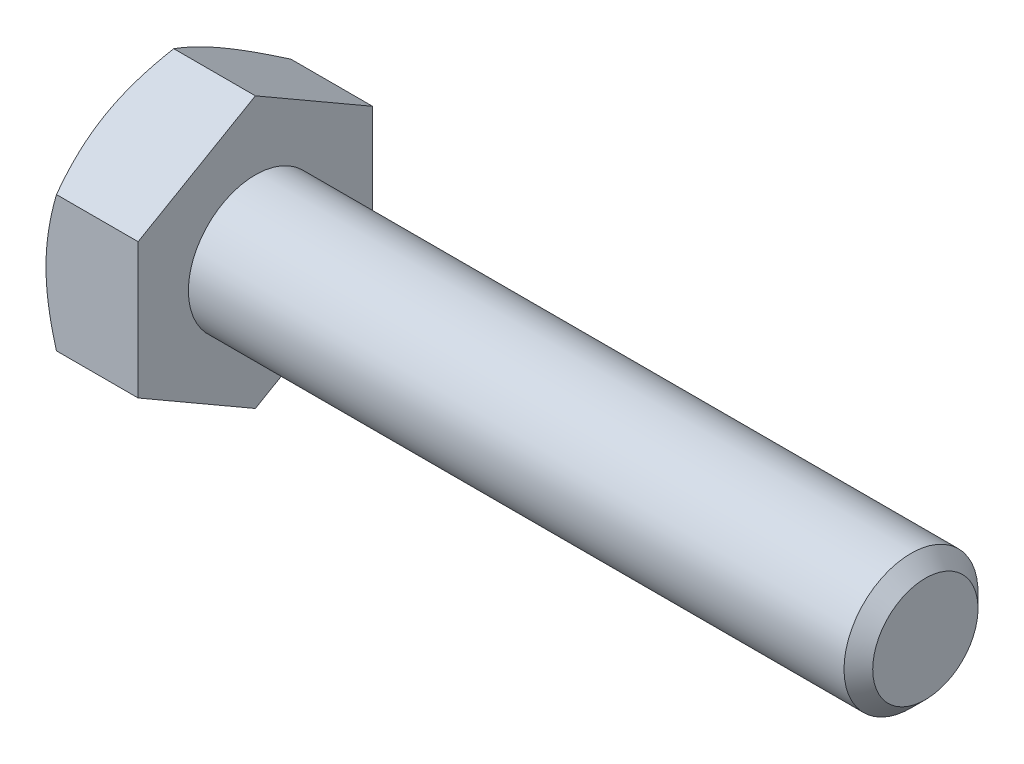
ISO-10303-21;
HEADER;
FILE_DESCRIPTION(('STEP AP214'),'2;1');
FILE_NAME('part.step','',(''),(''),'','','');
FILE_SCHEMA(('AUTOMOTIVE_DESIGN { 1 0 10303 214 1 1 1 1 }'));
ENDSEC;
DATA;
#1=APPLICATION_CONTEXT('core data for automotive mechanical design processes');
#2=APPLICATION_PROTOCOL_DEFINITION('international standard','automotive_design',2000,#1);
#3=PRODUCT_CONTEXT('',#1,'mechanical');
#4=PRODUCT('Part','Part','',(#3));
#5=PRODUCT_RELATED_PRODUCT_CATEGORY('part','',(#4));
#6=PRODUCT_DEFINITION_FORMATION('','',#4);
#7=PRODUCT_DEFINITION_CONTEXT('part definition',#1,'design');
#8=PRODUCT_DEFINITION('design','',#6,#7);
#9=PRODUCT_DEFINITION_SHAPE('','',#8);
#10=(LENGTH_UNIT() NAMED_UNIT(*) SI_UNIT(.MILLI.,.METRE.));
#11=(NAMED_UNIT(*) PLANE_ANGLE_UNIT() SI_UNIT($,.RADIAN.));
#12=(NAMED_UNIT(*) SI_UNIT($,.STERADIAN.) SOLID_ANGLE_UNIT());
#13=UNCERTAINTY_MEASURE_WITH_UNIT(LENGTH_MEASURE(1.E-05),#10,'distance_accuracy_value','');
#14=(GEOMETRIC_REPRESENTATION_CONTEXT(3) GLOBAL_UNCERTAINTY_ASSIGNED_CONTEXT((#13)) GLOBAL_UNIT_ASSIGNED_CONTEXT((#10,
#11,#12)) REPRESENTATION_CONTEXT('',''));
#15=CARTESIAN_POINT('',(0.,0.,0.));
#16=DIRECTION('',(0.,0.,1.));
#17=DIRECTION('',(1.,0.,0.));
#18=AXIS2_PLACEMENT_3D('',#15,#16,#17);
#19=CARTESIAN_POINT('',(-18.0578125,-3.20790243318485,5.55625));
#20=DIRECTION('',(0.,0.,-1.));
#21=DIRECTION('',(-1.,0.,0.));
#22=AXIS2_PLACEMENT_3D('',#19,#20,#21);
#23=PLANE('',#22);
#24=CARTESIAN_POINT('',(-15.2843750598475,-8.74399027782085,5.55625));
#25=CARTESIAN_POINT('',(-15.4031476461868,-8.50018623960062,5.55625));
#26=CARTESIAN_POINT('',(-15.5208174899284,-8.25583594381363,5.55625));
#27=CARTESIAN_POINT('',(-15.753333832282,-7.76575275757413,5.55625));
#28=CARTESIAN_POINT('',(-15.868179909394,-7.52001966736057,5.55625));
#29=CARTESIAN_POINT('',(-16.0949815667827,-7.02567502384834,5.55625));
#30=CARTESIAN_POINT('',(-16.2069190770691,-6.77705515244963,5.55625));
#31=CARTESIAN_POINT('',(-16.4263791452201,-6.27788161036476,5.55625));
#32=CARTESIAN_POINT('',(-16.5339019036307,-6.02732802813559,5.55625));
#33=CARTESIAN_POINT('',(-16.7469068972481,-5.51539046395943,5.55625));
#34=CARTESIAN_POINT('',(-16.852197701029,-5.25392641019769,5.55625));
#35=CARTESIAN_POINT('',(-17.0551139859531,-4.72798657633179,5.55625));
#36=CARTESIAN_POINT('',(-17.1527386251359,-4.46351046906169,5.55625));
#37=CARTESIAN_POINT('',(-17.3378532159805,-3.93158168881508,5.55625));
#38=CARTESIAN_POINT('',(-17.4253626158621,-3.66413584916098,5.55625));
#39=CARTESIAN_POINT('',(-17.5875224426472,-3.12540698244495,5.55625));
#40=CARTESIAN_POINT('',(-17.6621767862806,-2.8541251515052,5.55625));
#41=CARTESIAN_POINT('',(-17.7947361579561,-2.30908269819076,5.55625));
#42=CARTESIAN_POINT('',(-17.8527346690269,-2.03534517239951,5.55625));
#43=CARTESIAN_POINT('',(-17.9487733321313,-1.4842981003853,5.55625));
#44=CARTESIAN_POINT('',(-17.9868156464521,-1.20698894449172,5.55625));
#45=CARTESIAN_POINT('',(-18.0263928025883,-0.79129473023844,5.55625));
#46=CARTESIAN_POINT('',(-18.0366589019217,-0.653708210797405,5.55625));
#47=CARTESIAN_POINT('',(-18.0513621872178,-0.3782286898733,5.55625));
#48=CARTESIAN_POINT('',(-18.0557999263492,-0.240335718720036,5.55625));
#49=CARTESIAN_POINT('',(-18.0587354775746,0.035525129473498,5.55625));
#50=CARTESIAN_POINT('',(-18.0572327728321,0.173493011987118,5.55625));
#51=CARTESIAN_POINT('',(-18.0483265101621,0.449228444418538,5.55625));
#52=CARTESIAN_POINT('',(-18.0409231815845,0.586996001914223,5.55625));
#53=CARTESIAN_POINT('',(-18.0164869357947,0.914267814879004,5.55625));
#54=CARTESIAN_POINT('',(-17.9968672240741,1.10358330996904,5.55625));
#55=CARTESIAN_POINT('',(-17.947526812407,1.48088314069775,5.55625));
#56=CARTESIAN_POINT('',(-17.9178048478651,1.66886730667232,5.55625));
#57=CARTESIAN_POINT('',(-17.8150555520625,2.23056093652213,5.55625));
#58=CARTESIAN_POINT('',(-17.7284606134045,2.60182549681906,5.55625));
#59=CARTESIAN_POINT('',(-17.5773261064939,3.15725728719583,5.55625));
#60=CARTESIAN_POINT('',(-17.5226586125065,3.3442770213325,5.55625));
#61=CARTESIAN_POINT('',(-17.4074060536328,3.71650214758287,5.55625));
#62=CARTESIAN_POINT('',(-17.3468209432783,3.90170752574391,5.55625));
#63=CARTESIAN_POINT('',(-17.2207250472581,4.27035971017339,5.55625));
#64=CARTESIAN_POINT('',(-17.1552156566373,4.45380699802655,5.55625));
#65=CARTESIAN_POINT('',(-17.0200659146603,4.81916376337002,5.55625));
#66=CARTESIAN_POINT('',(-16.9504256570347,5.00107327564605,5.55625));
#67=CARTESIAN_POINT('',(-16.7580333966823,5.48965633955828,5.55625));
#68=CARTESIAN_POINT('',(-16.6320472769738,5.79505515575442,5.55625));
#69=CARTESIAN_POINT('',(-16.3726962852557,6.40271511378121,5.55625));
#70=CARTESIAN_POINT('',(-16.2393306013023,6.70497590598521,5.55625));
#71=CARTESIAN_POINT('',(-15.9669631146457,7.30707795189491,5.55625));
#72=CARTESIAN_POINT('',(-15.8279591790448,7.60691823753555,5.55625));
#73=CARTESIAN_POINT('',(-15.5456603653161,8.20455029953287,5.55625));
#74=CARTESIAN_POINT('',(-15.4023656605298,8.50234215804727,5.55625));
#75=CARTESIAN_POINT('',(-15.1121870855033,9.09675869917467,5.55625));
#76=CARTESIAN_POINT('',(-14.9652978399505,9.39338075230971,5.55625));
#77=CARTESIAN_POINT('',(-14.668841477218,9.98528417281852,5.55625));
#78=CARTESIAN_POINT('',(-14.5192743379345,10.2805655291008,5.55625));
#79=CARTESIAN_POINT('',(-14.0674394266152,11.1646418956815,5.55625));
#80=CARTESIAN_POINT('',(-13.7619730016145,11.7518013851031,5.55625));
#81=CARTESIAN_POINT('',(-13.1778679596005,12.8613257548756,5.55625));
#82=CARTESIAN_POINT('',(-12.8997985850975,13.3839917708193,5.55625));
#83=CARTESIAN_POINT('',(-12.340301428865,14.42756352459,5.55625));
#84=CARTESIAN_POINT('',(-12.0588734420222,14.9484691523898,5.55625));
#85=CARTESIAN_POINT('',(-11.4944769946515,15.9871872994246,5.55625));
#86=CARTESIAN_POINT('',(-11.2115168360065,16.5050043366708,5.55625));
#87=CARTESIAN_POINT('',(-10.6436898665637,17.5395393792358,5.55625));
#88=CARTESIAN_POINT('',(-10.3588232075218,18.056257467815,5.55625));
#89=CARTESIAN_POINT('',(-10.0732623528106,18.5725892171576,5.55625));
#90=B_SPLINE_CURVE_WITH_KNOTS('',3,(#24,#25,#26,#27,#28,#29,#30,#31,#32,#33,#34,#35,#36,#37,#38,
#39,#40,#41,#42,#43,#44,#45,#46,#47,#48,#49,#50,#51,#52,#53,#54,#55,#56,#57,#58,#59,#60,#61,#62,
#63,#64,#65,#66,#67,#68,#69,#70,#71,#72,#73,#74,#75,#76,#77,#78,#79,#80,#81,#82,#83,#84,#85,#86,
#87,#88,#89),.UNSPECIFIED.,.F.,.F.,(4,2,2,2,2,2,2,2,2,2,2,2,2,2,2,2,2,2,2,2,2,2,2,2,2,2,2,2,2,2,
2,2,4),(0.,0.813597715870462,1.62731614804298,2.44525275654031,3.26315216797368,
4.10866347940256,4.95426752225437,5.79821771301645,6.64191030891903,7.48077063935046,
8.31954005908318,8.73334237828505,9.1471054207352,9.56090446260157,9.97468742138603,
10.5453561295019,11.1160962999972,12.2581342200709,12.8426194652768,13.4271092017353,
14.0114339722529,14.5957454893196,15.586695188948,16.5777541364282,17.5691915541017,
18.560588972886,19.5535724635683,20.5465641542476,22.5321054768716,24.308190208571,
26.0843839680985,27.8546363109357,29.624749380466),.UNSPECIFIED.);
#91=CARTESIAN_POINT('',(-17.5615482665182,-3.20790243318485,5.55625));
#92=VERTEX_POINT('',#91);
#93=CARTESIAN_POINT('',(-18.0578125,0.,5.55625));
#94=VERTEX_POINT('',#93);
#95=EDGE_CURVE('E254',#92,#94,#90,.T.);
#96=ORIENTED_EDGE('',*,*,#95,.F.);
#97=DIRECTION('',(1.,0.,0.));
#98=VECTOR('',#97,1.);
#99=CARTESIAN_POINT('',(-18.0578125,-3.20790243318485,5.55625));
#100=LINE('',#99,#98);
#101=CARTESIAN_POINT('',(-13.6921875,-3.20790243318485,5.55625));
#102=VERTEX_POINT('',#101);
#103=EDGE_CURVE('E257',#92,#102,#100,.T.);
#104=ORIENTED_EDGE('',*,*,#103,.T.);
#105=DIRECTION('',(0.,1.,0.));
#106=VECTOR('',#105,1.);
#107=CARTESIAN_POINT('',(-13.6921875,-3.20790243318485,5.55625));
#108=LINE('',#107,#106);
#109=CARTESIAN_POINT('',(-13.6921875,3.20790243318486,5.55625));
#110=VERTEX_POINT('',#109);
#111=EDGE_CURVE('E259',#102,#110,#108,.T.);
#112=ORIENTED_EDGE('',*,*,#111,.T.);
#113=DIRECTION('',(1.,0.,0.));
#114=VECTOR('',#113,1.);
#115=CARTESIAN_POINT('',(-18.0578125,3.20790243318486,5.55625));
#116=LINE('',#115,#114);
#117=CARTESIAN_POINT('',(-17.5615482665182,3.20790243318486,5.55625));
#118=VERTEX_POINT('',#117);
#119=EDGE_CURVE('E227',#118,#110,#116,.T.);
#120=ORIENTED_EDGE('',*,*,#119,.F.);
#121=EDGE_CURVE('E111',#94,#118,#90,.T.);
#122=ORIENTED_EDGE('',*,*,#121,.F.);
#123=EDGE_LOOP('',(#96,#104,#112,#120,#122));
#124=FACE_BOUND('',#123,.T.);
#125=ADVANCED_FACE('F35',(#124),#23,.F.);
#126=CARTESIAN_POINT('',(-18.0578125,3.20790243318486,5.55625));
#127=DIRECTION('',(0.,-0.866025403784439,-0.5));
#128=DIRECTION('',(0.,0.5,-0.866025403784439));
#129=AXIS2_PLACEMENT_3D('',#126,#127,#128);
#130=PLANE('',#129);
#131=CARTESIAN_POINT('',(-17.5614815980518,3.20778696313102,5.55645));
#132=CARTESIAN_POINT('',(-17.6021869396287,3.27830048099898,5.43431700443227));
#133=CARTESIAN_POINT('',(-17.6410449606368,3.34907690760433,5.31172863757365));
#134=CARTESIAN_POINT('',(-17.7145575665754,3.49120454378004,5.06555635055765));
#135=CARTESIAN_POINT('',(-17.7492103381981,3.56255598725623,4.94197202526351));
#136=CARTESIAN_POINT('',(-17.8461806144389,3.7777527611819,4.56924027919934));
#137=CARTESIAN_POINT('',(-17.901336445498,3.92244755263586,4.3186215488105));
#138=CARTESIAN_POINT('',(-17.966013595153,4.13898067940738,3.94357517172046));
#139=CARTESIAN_POINT('',(-17.9844383296374,4.21017202280888,3.82026814788998));
#140=CARTESIAN_POINT('',(-18.0153341337597,4.35287639627881,3.57309692257779));
#141=CARTESIAN_POINT('',(-18.027805729438,4.42438939736052,3.44923277130254));
#142=CARTESIAN_POINT('',(-18.0464774134017,4.56753961185542,3.20128932668299));
#143=CARTESIAN_POINT('',(-18.0526846193166,4.63917659144933,3.07721043832556));
#144=CARTESIAN_POINT('',(-18.0587010825862,4.7825127822332,2.82894487332451));
#145=CARTESIAN_POINT('',(-18.0585105375727,4.85421199143242,2.70475820012895));
#146=CARTESIAN_POINT('',(-18.0491942573071,5.05064720059278,2.36452243746779));
#147=CARTESIAN_POINT('',(-18.0335528403106,5.1753189069971,2.14858470770919));
#148=CARTESIAN_POINT('',(-17.9839525950254,5.42383425573453,1.71814349723526));
#149=CARTESIAN_POINT('',(-17.9499768117333,5.54767702400135,1.50364153044716));
#150=CARTESIAN_POINT('',(-17.8650467499519,5.79669255822861,1.07233397329164));
#151=CARTESIAN_POINT('',(-17.8137326119579,5.92183390122649,0.8555828090919));
#152=CARTESIAN_POINT('',(-17.6972700447076,6.17025031750737,0.425312954659249));
#153=CARTESIAN_POINT('',(-17.6321489741206,6.29352857247572,0.211788753585623));
#154=CARTESIAN_POINT('',(-17.5614815980518,6.41592033642355,-0.000199999999998247));
#155=B_SPLINE_CURVE_WITH_KNOTS('',3,(#131,#132,#133,#134,#135,#136,#137,#138,#139,#140,#141,
#142,#143,#144,#145,#146,#147,#148,#149,#150,#151,#152,#153,#154),.UNSPECIFIED.,.F.,.F.,(4,2,2,
2,2,2,2,2,2,2,2,4),(0.,0.440316908268042,0.880823012040824,1.76366572331169,2.19427472390783,
2.62484566732156,3.05492684132792,3.4849947297767,4.23370964386675,4.98311813377593,
5.74914806559357,6.51367405016873),.UNSPECIFIED.);
#156=CARTESIAN_POINT('',(-18.0578125,4.81185364977729,2.778125));
#157=VERTEX_POINT('',#156);
#158=EDGE_CURVE('E107',#118,#157,#155,.T.);
#159=ORIENTED_EDGE('',*,*,#158,.F.);
#160=ORIENTED_EDGE('',*,*,#119,.T.);
#161=DIRECTION('',(0.,0.5,-0.866025403784438));
#162=VECTOR('',#161,1.);
#163=CARTESIAN_POINT('',(-13.6921875,3.20790243318486,5.55625));
#164=LINE('',#163,#162);
#165=CARTESIAN_POINT('',(-13.6921875,6.41580486636972,0.));
#166=VERTEX_POINT('',#165);
#167=EDGE_CURVE('E277',#110,#166,#164,.T.);
#168=ORIENTED_EDGE('',*,*,#167,.T.);
#169=DIRECTION('',(1.,0.,0.));
#170=VECTOR('',#169,1.);
#171=CARTESIAN_POINT('',(-18.0578125,6.41580486636972,0.));
#172=LINE('',#171,#170);
#173=CARTESIAN_POINT('',(-17.5615482665182,6.41580486636972,0.));
#174=VERTEX_POINT('',#173);
#175=EDGE_CURVE('E130',#174,#166,#172,.T.);
#176=ORIENTED_EDGE('',*,*,#175,.F.);
#177=EDGE_CURVE('E115',#157,#174,#155,.T.);
#178=ORIENTED_EDGE('',*,*,#177,.F.);
#179=EDGE_LOOP('',(#159,#160,#168,#176,#178));
#180=FACE_BOUND('',#179,.T.);
#181=ADVANCED_FACE('F128',(#180),#130,.F.);
#182=CARTESIAN_POINT('',(-18.0578125,6.41580486636972,0.));
#183=DIRECTION('',(0.,-0.866025403784439,0.5));
#184=DIRECTION('',(0.,-0.5,-0.866025403784439));
#185=AXIS2_PLACEMENT_3D('',#182,#183,#184);
#186=PLANE('',#185);
#187=CARTESIAN_POINT('',(-17.5614815980518,6.41592033642355,0.000200000000001893));
#188=CARTESIAN_POINT('',(-17.6021869396287,6.34540681855559,-0.121932995567729));
#189=CARTESIAN_POINT('',(-17.6410449606368,6.27463039195025,-0.244521362426351));
#190=CARTESIAN_POINT('',(-17.7145575665754,6.13250275577453,-0.490693649442355));
#191=CARTESIAN_POINT('',(-17.7492103381981,6.06115131229835,-0.614277974736486));
#192=CARTESIAN_POINT('',(-17.8461806144389,5.84595453837268,-0.987009720800661));
#193=CARTESIAN_POINT('',(-17.901336445498,5.70125974691872,-1.2376284511895));
#194=CARTESIAN_POINT('',(-17.966013595153,5.48472662014719,-1.61267482827954));
#195=CARTESIAN_POINT('',(-17.9844383296374,5.41353527674569,-1.73598185211002));
#196=CARTESIAN_POINT('',(-18.0153341337597,5.27083090327577,-1.98315307742221));
#197=CARTESIAN_POINT('',(-18.027805729438,5.19931790219406,-2.10701722869746));
#198=CARTESIAN_POINT('',(-18.0464774134017,5.05616768769916,-2.35496067331701));
#199=CARTESIAN_POINT('',(-18.0526846193166,4.98453070810525,-2.47903956167444));
#200=CARTESIAN_POINT('',(-18.0587010825862,4.84119451732138,-2.72730512667549));
#201=CARTESIAN_POINT('',(-18.0585105375727,4.76949530812216,-2.85149179987105));
#202=CARTESIAN_POINT('',(-18.0491942573071,4.5730600989618,-3.19172756253221));
#203=CARTESIAN_POINT('',(-18.0335528403106,4.44838839255747,-3.40766529229081));
#204=CARTESIAN_POINT('',(-17.9839525950254,4.19987304382004,-3.83810650276474));
#205=CARTESIAN_POINT('',(-17.9499768117333,4.07603027555323,-4.05260846955284));
#206=CARTESIAN_POINT('',(-17.8650467499519,3.82701474132597,-4.48391602670836));
#207=CARTESIAN_POINT('',(-17.8137326119579,3.70187339832809,-4.7006671909081));
#208=CARTESIAN_POINT('',(-17.6972700447076,3.45345698204721,-5.13093704534075));
#209=CARTESIAN_POINT('',(-17.6321489741206,3.33017872707885,-5.34446124641438));
#210=CARTESIAN_POINT('',(-17.5614815980518,3.20778696313102,-5.55645));
#211=B_SPLINE_CURVE_WITH_KNOTS('',3,(#187,#188,#189,#190,#191,#192,#193,#194,#195,#196,#197,
#198,#199,#200,#201,#202,#203,#204,#205,#206,#207,#208,#209,#210),.UNSPECIFIED.,.F.,.F.,(4,2,2,
2,2,2,2,2,2,2,2,4),(0.,0.440316908268041,0.880823012040823,1.76366572331169,2.19427472390783,
2.62484566732156,3.05492684132792,3.48499472977669,4.23370964386674,4.98311813377593,
5.74914806559356,6.51367405016872),.UNSPECIFIED.);
#212=CARTESIAN_POINT('',(-18.0578125,4.81185364977729,-2.778125));
#213=VERTEX_POINT('',#212);
#214=EDGE_CURVE('E120',#174,#213,#211,.T.);
#215=ORIENTED_EDGE('',*,*,#214,.F.);
#216=ORIENTED_EDGE('',*,*,#175,.T.);
#217=DIRECTION('',(0.,-0.5,-0.866025403784439));
#218=VECTOR('',#217,1.);
#219=CARTESIAN_POINT('',(-13.6921875,6.41580486636972,0.));
#220=LINE('',#219,#218);
#221=CARTESIAN_POINT('',(-13.6921875,3.20790243318486,-5.55625));
#222=VERTEX_POINT('',#221);
#223=EDGE_CURVE('E274',#166,#222,#220,.T.);
#224=ORIENTED_EDGE('',*,*,#223,.T.);
#225=DIRECTION('',(1.,0.,0.));
#226=VECTOR('',#225,1.);
#227=CARTESIAN_POINT('',(-18.0578125,3.20790243318486,-5.55625));
#228=LINE('',#227,#226);
#229=CARTESIAN_POINT('',(-17.5615482665182,3.20790243318486,-5.55625));
#230=VERTEX_POINT('',#229);
#231=EDGE_CURVE('E271',#230,#222,#228,.T.);
#232=ORIENTED_EDGE('',*,*,#231,.F.);
#233=EDGE_CURVE('E131',#213,#230,#211,.T.);
#234=ORIENTED_EDGE('',*,*,#233,.F.);
#235=EDGE_LOOP('',(#215,#216,#224,#232,#234));
#236=FACE_BOUND('',#235,.T.);
#237=ADVANCED_FACE('F191',(#236),#186,.F.);
#238=CARTESIAN_POINT('',(-18.0578125,3.20790243318486,-5.55625));
#239=DIRECTION('',(0.,0.,1.));
#240=DIRECTION('',(1.,0.,0.));
#241=AXIS2_PLACEMENT_3D('',#238,#239,#240);
#242=PLANE('',#241);
#243=CARTESIAN_POINT('',(-15.2843750598475,-8.74399027782085,-5.55625));
#244=CARTESIAN_POINT('',(-15.4031476461868,-8.50018623960062,-5.55625));
#245=CARTESIAN_POINT('',(-15.5208174899284,-8.25583594381363,-5.55625));
#246=CARTESIAN_POINT('',(-15.753333832282,-7.76575275757413,-5.55625));
#247=CARTESIAN_POINT('',(-15.868179909394,-7.52001966736057,-5.55625));
#248=CARTESIAN_POINT('',(-16.0949815667827,-7.02567502384834,-5.55625));
#249=CARTESIAN_POINT('',(-16.2069190770691,-6.77705515244963,-5.55625));
#250=CARTESIAN_POINT('',(-16.4263791452201,-6.27788161036476,-5.55625));
#251=CARTESIAN_POINT('',(-16.5339019036307,-6.02732802813559,-5.55625));
#252=CARTESIAN_POINT('',(-16.7469068972481,-5.51539046395943,-5.55625));
#253=CARTESIAN_POINT('',(-16.852197701029,-5.25392641019769,-5.55625));
#254=CARTESIAN_POINT('',(-17.0551139859531,-4.72798657633179,-5.55625));
#255=CARTESIAN_POINT('',(-17.1527386251359,-4.46351046906169,-5.55625));
#256=CARTESIAN_POINT('',(-17.3378532159805,-3.93158168881508,-5.55625));
#257=CARTESIAN_POINT('',(-17.4253626158621,-3.66413584916098,-5.55625));
#258=CARTESIAN_POINT('',(-17.5875224426472,-3.12540698244495,-5.55625));
#259=CARTESIAN_POINT('',(-17.6621767862806,-2.8541251515052,-5.55625));
#260=CARTESIAN_POINT('',(-17.7947361579561,-2.30908269819076,-5.55625));
#261=CARTESIAN_POINT('',(-17.8527346690269,-2.03534517239951,-5.55625));
#262=CARTESIAN_POINT('',(-17.9487733321313,-1.4842981003853,-5.55625));
#263=CARTESIAN_POINT('',(-17.9868156464521,-1.20698894449172,-5.55625));
#264=CARTESIAN_POINT('',(-18.0263928025883,-0.791294730238441,-5.55625));
#265=CARTESIAN_POINT('',(-18.0366589019217,-0.653708210797407,-5.55625));
#266=CARTESIAN_POINT('',(-18.0513621872178,-0.378228689873302,-5.55625));
#267=CARTESIAN_POINT('',(-18.0557999263492,-0.240335718720039,-5.55625));
#268=CARTESIAN_POINT('',(-18.0587354775746,0.0355251294734939,-5.55625));
#269=CARTESIAN_POINT('',(-18.0572327728321,0.173493011987113,-5.55625));
#270=CARTESIAN_POINT('',(-18.0483265101621,0.449228444418532,-5.55625));
#271=CARTESIAN_POINT('',(-18.0409231815845,0.586996001914216,-5.55625));
#272=CARTESIAN_POINT('',(-18.0164869357947,0.914267814878997,-5.55625));
#273=CARTESIAN_POINT('',(-17.9968672240741,1.10358330996903,-5.55625));
#274=CARTESIAN_POINT('',(-17.947526812407,1.48088314069774,-5.55625));
#275=CARTESIAN_POINT('',(-17.9178048478651,1.66886730667231,-5.55625));
#276=CARTESIAN_POINT('',(-17.8150555520625,2.23056093652212,-5.55625));
#277=CARTESIAN_POINT('',(-17.7284606134045,2.60182549681905,-5.55625));
#278=CARTESIAN_POINT('',(-17.5773261064939,3.15725728719582,-5.55625));
#279=CARTESIAN_POINT('',(-17.5226586125065,3.34427702133249,-5.55625));
#280=CARTESIAN_POINT('',(-17.4074060536328,3.71650214758286,-5.55625));
#281=CARTESIAN_POINT('',(-17.3468209432783,3.9017075257439,-5.55625));
#282=CARTESIAN_POINT('',(-17.2207250472581,4.27035971017337,-5.55625));
#283=CARTESIAN_POINT('',(-17.1552156566373,4.45380699802653,-5.55625));
#284=CARTESIAN_POINT('',(-17.0200659146603,4.81916376337001,-5.55625));
#285=CARTESIAN_POINT('',(-16.9504256570347,5.00107327564603,-5.55625));
#286=CARTESIAN_POINT('',(-16.7580333966823,5.48965633955827,-5.55625));
#287=CARTESIAN_POINT('',(-16.6320472769738,5.7950551557544,-5.55625));
#288=CARTESIAN_POINT('',(-16.3726962852557,6.4027151137812,-5.55625));
#289=CARTESIAN_POINT('',(-16.2393306013024,6.7049759059852,-5.55625));
#290=CARTESIAN_POINT('',(-15.9669631146457,7.3070779518949,-5.55625));
#291=CARTESIAN_POINT('',(-15.8279591790448,7.60691823753554,-5.55625));
#292=CARTESIAN_POINT('',(-15.5456603653161,8.20455029953286,-5.55625));
#293=CARTESIAN_POINT('',(-15.4023656605298,8.50234215804726,-5.55625));
#294=CARTESIAN_POINT('',(-15.1121870855033,9.09675869917466,-5.55625));
#295=CARTESIAN_POINT('',(-14.9652978399505,9.3933807523097,-5.55625));
#296=CARTESIAN_POINT('',(-14.668841477218,9.98528417281851,-5.55625));
#297=CARTESIAN_POINT('',(-14.5192743379345,10.2805655291008,-5.55625));
#298=CARTESIAN_POINT('',(-14.0674394266152,11.1646418956815,-5.55625));
#299=CARTESIAN_POINT('',(-13.7619730016145,11.7518013851031,-5.55625));
#300=CARTESIAN_POINT('',(-13.1778679596005,12.8613257548756,-5.55625));
#301=CARTESIAN_POINT('',(-12.8997985850975,13.3839917708193,-5.55625));
#302=CARTESIAN_POINT('',(-12.340301428865,14.42756352459,-5.55625));
#303=CARTESIAN_POINT('',(-12.0588734420222,14.9484691523898,-5.55625));
#304=CARTESIAN_POINT('',(-11.4944769946515,15.9871872994245,-5.55625));
#305=CARTESIAN_POINT('',(-11.2115168360065,16.5050043366708,-5.55625));
#306=CARTESIAN_POINT('',(-10.6436898665637,17.5395393792358,-5.55625));
#307=CARTESIAN_POINT('',(-10.3588232075218,18.056257467815,-5.55625));
#308=CARTESIAN_POINT('',(-10.0732623528106,18.5725892171576,-5.55625));
#309=B_SPLINE_CURVE_WITH_KNOTS('',3,(#243,#244,#245,#246,#247,#248,#249,#250,#251,#252,#253,
#254,#255,#256,#257,#258,#259,#260,#261,#262,#263,#264,#265,#266,#267,#268,#269,#270,#271,#272,
#273,#274,#275,#276,#277,#278,#279,#280,#281,#282,#283,#284,#285,#286,#287,#288,#289,#290,#291,
#292,#293,#294,#295,#296,#297,#298,#299,#300,#301,#302,#303,#304,#305,#306,#307,#308),
.UNSPECIFIED.,.F.,.F.,(4,2,2,2,2,2,2,2,2,2,2,2,2,2,2,2,2,2,2,2,2,2,2,2,2,2,2,2,2,2,2,2,4),(0.,
0.813597715870461,1.62731614804298,2.44525275654031,3.26315216797367,4.10866347940256,
4.95426752225437,5.79821771301645,6.64191030891902,7.48077063935046,8.31954005908318,
8.73334237828505,9.14710542073519,9.56090446260156,9.97468742138602,10.5453561295019,
11.1160962999972,12.2581342200709,12.8426194652768,13.4271092017353,14.0114339722529,
14.5957454893196,15.5866951889479,16.5777541364282,17.5691915541016,18.5605889728859,
19.5535724635683,20.5465641542476,22.5321054768716,24.308190208571,26.0843839680985,
27.8546363109357,29.624749380466),.UNSPECIFIED.);
#310=CARTESIAN_POINT('',(-18.0578125,0.,-5.55625));
#311=VERTEX_POINT('',#310);
#312=EDGE_CURVE('E185',#230,#311,#309,.F.);
#313=ORIENTED_EDGE('',*,*,#312,.F.);
#314=ORIENTED_EDGE('',*,*,#231,.T.);
#315=DIRECTION('',(0.,-1.,0.));
#316=VECTOR('',#315,1.);
#317=CARTESIAN_POINT('',(-13.6921875,3.20790243318486,-5.55625));
#318=LINE('',#317,#316);
#319=CARTESIAN_POINT('',(-13.6921875,-3.20790243318486,-5.55625));
#320=VERTEX_POINT('',#319);
#321=EDGE_CURVE('E281',#222,#320,#318,.T.);
#322=ORIENTED_EDGE('',*,*,#321,.T.);
#323=DIRECTION('',(1.,0.,0.));
#324=VECTOR('',#323,1.);
#325=CARTESIAN_POINT('',(-18.0578125,-3.20790243318486,-5.55625));
#326=LINE('',#325,#324);
#327=CARTESIAN_POINT('',(-17.5615482665182,-3.20790243318486,-5.55625));
#328=VERTEX_POINT('',#327);
#329=EDGE_CURVE('E242',#328,#320,#326,.T.);
#330=ORIENTED_EDGE('',*,*,#329,.F.);
#331=EDGE_CURVE('E179',#311,#328,#309,.F.);
#332=ORIENTED_EDGE('',*,*,#331,.F.);
#333=EDGE_LOOP('',(#313,#314,#322,#330,#332));
#334=FACE_BOUND('',#333,.T.);
#335=ADVANCED_FACE('F187',(#334),#242,.F.);
#336=CARTESIAN_POINT('',(-18.0578125,-3.20790243318486,-5.55625));
#337=DIRECTION('',(0.,0.866025403784439,0.5));
#338=DIRECTION('',(0.,-0.5,0.866025403784439));
#339=AXIS2_PLACEMENT_3D('',#336,#337,#338);
#340=PLANE('',#339);
#341=CARTESIAN_POINT('',(-17.5614815980518,-3.20778696313102,-5.55645));
#342=CARTESIAN_POINT('',(-17.6021869396287,-3.27830048099898,-5.43431700443227));
#343=CARTESIAN_POINT('',(-17.6410449606368,-3.34907690760433,-5.31172863757364));
#344=CARTESIAN_POINT('',(-17.7145575665754,-3.49120454378004,-5.06555635055764));
#345=CARTESIAN_POINT('',(-17.7492103381981,-3.56255598725623,-4.94197202526351));
#346=CARTESIAN_POINT('',(-17.8461806144389,-3.7777527611819,-4.56924027919934));
#347=CARTESIAN_POINT('',(-17.901336445498,-3.92244755263586,-4.3186215488105));
#348=CARTESIAN_POINT('',(-17.966013595153,-4.13898067940738,-3.94357517172046));
#349=CARTESIAN_POINT('',(-17.9844383296374,-4.21017202280888,-3.82026814788997));
#350=CARTESIAN_POINT('',(-18.0153341337597,-4.35287639627881,-3.57309692257778));
#351=CARTESIAN_POINT('',(-18.027805729438,-4.42438939736051,-3.44923277130254));
#352=CARTESIAN_POINT('',(-18.0464774134017,-4.56753961185542,-3.20128932668298));
#353=CARTESIAN_POINT('',(-18.0526846193166,-4.63917659144933,-3.07721043832556));
#354=CARTESIAN_POINT('',(-18.0587010825862,-4.7825127822332,-2.82894487332451));
#355=CARTESIAN_POINT('',(-18.0585105375727,-4.85421199143242,-2.70475820012895));
#356=CARTESIAN_POINT('',(-18.0491942573071,-5.05064720059277,-2.36452243746779));
#357=CARTESIAN_POINT('',(-18.0335528403106,-5.1753189069971,-2.14858470770919));
#358=CARTESIAN_POINT('',(-17.9839525950254,-5.42383425573453,-1.71814349723526));
#359=CARTESIAN_POINT('',(-17.9499768117333,-5.54767702400135,-1.50364153044716));
#360=CARTESIAN_POINT('',(-17.8650467499519,-5.7966925582286,-1.07233397329164));
#361=CARTESIAN_POINT('',(-17.8137326119579,-5.92183390122649,-0.855582809091897));
#362=CARTESIAN_POINT('',(-17.6972700447076,-6.17025031750736,-0.425312954659247));
#363=CARTESIAN_POINT('',(-17.6321489741206,-6.29352857247572,-0.21178875358562));
#364=CARTESIAN_POINT('',(-17.5614815980518,-6.41592033642355,0.000200000000000638));
#365=B_SPLINE_CURVE_WITH_KNOTS('',3,(#341,#342,#343,#344,#345,#346,#347,#348,#349,#350,#351,
#352,#353,#354,#355,#356,#357,#358,#359,#360,#361,#362,#363,#364),.UNSPECIFIED.,.F.,.F.,(4,2,2,
2,2,2,2,2,2,2,2,4),(0.,0.440316908268041,0.880823012040823,1.76366572331169,2.19427472390783,
2.62484566732156,3.05492684132792,3.48499472977669,4.23370964386674,4.98311813377593,
5.74914806559356,6.51367405016872),.UNSPECIFIED.);
#366=CARTESIAN_POINT('',(-18.0578125,-4.81185364977729,-2.778125));
#367=VERTEX_POINT('',#366);
#368=EDGE_CURVE('E186',#328,#367,#365,.T.);
#369=ORIENTED_EDGE('',*,*,#368,.F.);
#370=ORIENTED_EDGE('',*,*,#329,.T.);
#371=DIRECTION('',(0.,-0.5,0.866025403784439));
#372=VECTOR('',#371,1.);
#373=CARTESIAN_POINT('',(-13.6921875,-3.20790243318486,-5.55625));
#374=LINE('',#373,#372);
#375=CARTESIAN_POINT('',(-13.6921875,-6.41580486636971,0.));
#376=VERTEX_POINT('',#375);
#377=EDGE_CURVE('E266',#320,#376,#374,.T.);
#378=ORIENTED_EDGE('',*,*,#377,.T.);
#379=DIRECTION('',(1.,0.,0.));
#380=VECTOR('',#379,1.);
#381=CARTESIAN_POINT('',(-18.0578125,-6.41580486636971,0.));
#382=LINE('',#381,#380);
#383=CARTESIAN_POINT('',(-17.5615482665182,-6.41580486636971,0.));
#384=VERTEX_POINT('',#383);
#385=EDGE_CURVE('E263',#384,#376,#382,.T.);
#386=ORIENTED_EDGE('',*,*,#385,.F.);
#387=EDGE_CURVE('E173',#367,#384,#365,.T.);
#388=ORIENTED_EDGE('',*,*,#387,.F.);
#389=EDGE_LOOP('',(#369,#370,#378,#386,#388));
#390=FACE_BOUND('',#389,.T.);
#391=ADVANCED_FACE('F190',(#390),#340,.F.);
#392=CARTESIAN_POINT('',(-18.0578125,-6.41580486636971,0.));
#393=DIRECTION('',(0.,0.866025403784439,-0.5));
#394=DIRECTION('',(0.,0.5,0.866025403784439));
#395=AXIS2_PLACEMENT_3D('',#392,#393,#394);
#396=PLANE('',#395);
#397=CARTESIAN_POINT('',(-17.5614815980518,-6.41592033642355,-0.000200000000000231));
#398=CARTESIAN_POINT('',(-17.6021869396287,-6.34540681855559,0.121932995567731));
#399=CARTESIAN_POINT('',(-17.6410449606368,-6.27463039195025,0.244521362426353));
#400=CARTESIAN_POINT('',(-17.7145575665754,-6.13250275577453,0.490693649442356));
#401=CARTESIAN_POINT('',(-17.7492103381981,-6.06115131229834,0.614277974736487));
#402=CARTESIAN_POINT('',(-17.8461806144389,-5.84595453837267,0.987009720800661));
#403=CARTESIAN_POINT('',(-17.901336445498,-5.70125974691872,1.2376284511895));
#404=CARTESIAN_POINT('',(-17.966013595153,-5.48472662014719,1.61267482827954));
#405=CARTESIAN_POINT('',(-17.9844383296374,-5.41353527674569,1.73598185211002));
#406=CARTESIAN_POINT('',(-18.0153341337597,-5.27083090327576,1.98315307742221));
#407=CARTESIAN_POINT('',(-18.027805729438,-5.19931790219406,2.10701722869746));
#408=CARTESIAN_POINT('',(-18.0464774134017,-5.05616768769915,2.35496067331701));
#409=CARTESIAN_POINT('',(-18.0526846193166,-4.98453070810525,2.47903956167444));
#410=CARTESIAN_POINT('',(-18.0587010825862,-4.84119451732137,2.72730512667549));
#411=CARTESIAN_POINT('',(-18.0585105375727,-4.76949530812215,2.85149179987105));
#412=CARTESIAN_POINT('',(-18.0491942573071,-4.5730600989618,3.19172756253221));
#413=CARTESIAN_POINT('',(-18.0335528403106,-4.44838839255747,3.40766529229081));
#414=CARTESIAN_POINT('',(-17.9839525950254,-4.19987304382004,3.83810650276474));
#415=CARTESIAN_POINT('',(-17.9499768117333,-4.07603027555323,4.05260846955284));
#416=CARTESIAN_POINT('',(-17.8650467499519,-3.82701474132597,4.48391602670836));
#417=CARTESIAN_POINT('',(-17.8137326119579,-3.70187339832808,4.7006671909081));
#418=CARTESIAN_POINT('',(-17.6972700447076,-3.45345698204721,5.13093704534075));
#419=CARTESIAN_POINT('',(-17.6321489741206,-3.33017872707885,5.34446124641438));
#420=CARTESIAN_POINT('',(-17.5614815980518,-3.20778696313102,5.55645));
#421=B_SPLINE_CURVE_WITH_KNOTS('',3,(#397,#398,#399,#400,#401,#402,#403,#404,#405,#406,#407,
#408,#409,#410,#411,#412,#413,#414,#415,#416,#417,#418,#419,#420),.UNSPECIFIED.,.F.,.F.,(4,2,2,
2,2,2,2,2,2,2,2,4),(0.,0.440316908268041,0.880823012040823,1.76366572331169,2.19427472390783,
2.62484566732156,3.05492684132792,3.48499472977669,4.23370964386674,4.98311813377593,
5.74914806559357,6.51367405016873),.UNSPECIFIED.);
#422=CARTESIAN_POINT('',(-18.0578125,-4.81185364977729,2.778125));
#423=VERTEX_POINT('',#422);
#424=EDGE_CURVE('E249',#384,#423,#421,.T.);
#425=ORIENTED_EDGE('',*,*,#424,.F.);
#426=ORIENTED_EDGE('',*,*,#385,.T.);
#427=DIRECTION('',(0.,0.5,0.866025403784439));
#428=VECTOR('',#427,1.);
#429=CARTESIAN_POINT('',(-13.6921875,-6.41580486636971,0.));
#430=LINE('',#429,#428);
#431=EDGE_CURVE('E261',#376,#102,#430,.T.);
#432=ORIENTED_EDGE('',*,*,#431,.T.);
#433=ORIENTED_EDGE('',*,*,#103,.F.);
#434=EDGE_CURVE('E125',#423,#92,#421,.T.);
#435=ORIENTED_EDGE('',*,*,#434,.F.);
#436=EDGE_LOOP('',(#425,#426,#432,#433,#435));
#437=FACE_BOUND('',#436,.T.);
#438=ADVANCED_FACE('F212',(#437),#396,.F.);
#439=CARTESIAN_POINT('',(-13.6921875,0.,0.));
#440=DIRECTION('',(1.,0.,0.));
#441=DIRECTION('',(0.,0.,-1.));
#442=AXIS2_PLACEMENT_3D('',#439,#440,#441);
#443=CYLINDRICAL_SURFACE('',#442,3.175);
#444=CARTESIAN_POINT('',(17.3774553571429,0.,0.));
#445=DIRECTION('',(1.,0.,0.));
#446=DIRECTION('',(0.,0.,-1.));
#447=AXIS2_PLACEMENT_3D('',#444,#445,#446);
#448=CIRCLE('',#447,3.175);
#449=CARTESIAN_POINT('',(17.3774553571429,0.,3.175));
#450=VERTEX_POINT('',#449);
#451=EDGE_CURVE('E221',#450,#450,#448,.F.);
#452=ORIENTED_EDGE('',*,*,#451,.T.);
#453=EDGE_LOOP('',(#452));
#454=FACE_BOUND('',#453,.T.);
#455=CARTESIAN_POINT('',(-13.6921875,0.,0.));
#456=DIRECTION('',(-1.,0.,0.));
#457=DIRECTION('',(0.,0.,1.));
#458=AXIS2_PLACEMENT_3D('',#455,#456,#457);
#459=CIRCLE('',#458,3.175);
#460=CARTESIAN_POINT('',(-13.6921875,0.,3.175));
#461=VERTEX_POINT('',#460);
#462=EDGE_CURVE('E224',#461,#461,#459,.F.);
#463=ORIENTED_EDGE('',*,*,#462,.T.);
#464=EDGE_LOOP('',(#463));
#465=FACE_BOUND('',#464,.T.);
#466=ADVANCED_FACE('F209',(#454,#465),#443,.T.);
#467=CARTESIAN_POINT('',(18.0578125,0.,0.));
#468=DIRECTION('',(1.,0.,0.));
#469=DIRECTION('',(0.,0.,-1.));
#470=AXIS2_PLACEMENT_3D('',#467,#468,#469);
#471=PLANE('',#470);
#472=CARTESIAN_POINT('',(18.0578125,0.,0.));
#473=DIRECTION('',(1.,0.,0.));
#474=DIRECTION('',(0.,0.,-1.));
#475=AXIS2_PLACEMENT_3D('',#472,#473,#474);
#476=CIRCLE('',#475,2.49464285714286);
#477=CARTESIAN_POINT('',(18.0578125,0.,2.49464285714286));
#478=VERTEX_POINT('',#477);
#479=EDGE_CURVE('E226',#478,#478,#476,.T.);
#480=ORIENTED_EDGE('',*,*,#479,.T.);
#481=EDGE_LOOP('',(#480));
#482=FACE_BOUND('',#481,.T.);
#483=ADVANCED_FACE('F207',(#482),#471,.T.);
#484=CARTESIAN_POINT('',(18.0578125,0.,0.));
#485=DIRECTION('',(-1.,0.,0.));
#486=DIRECTION('',(0.,0.,1.));
#487=AXIS2_PLACEMENT_3D('',#484,#485,#486);
#488=CONICAL_SURFACE('',#487,2.49464285714286,0.785398163397448);
#489=CARTESIAN_POINT('',(17.3774553571429,0.,3.175));
#490=CARTESIAN_POINT('',(17.3845424107143,0.,3.16791294642857));
#491=CARTESIAN_POINT('',(17.3916294642857,0.,3.16082589285714));
#492=CARTESIAN_POINT('',(17.4058035714286,0.,3.14665178571429));
#493=CARTESIAN_POINT('',(17.412890625,0.,3.13956473214286));
#494=CARTESIAN_POINT('',(17.4270647321429,0.,3.125390625));
#495=CARTESIAN_POINT('',(17.4341517857143,0.,3.11830357142857));
#496=CARTESIAN_POINT('',(17.4483258928571,0.,3.10412946428572));
#497=CARTESIAN_POINT('',(17.4554129464286,0.,3.09704241071429));
#498=CARTESIAN_POINT('',(17.4695870535714,0.,3.08286830357143));
#499=CARTESIAN_POINT('',(17.4766741071429,0.,3.07578125));
#500=CARTESIAN_POINT('',(17.4908482142857,0.,3.06160714285714));
#501=CARTESIAN_POINT('',(17.4979352678571,0.,3.05452008928572));
#502=CARTESIAN_POINT('',(17.512109375,0.,3.04034598214286));
#503=CARTESIAN_POINT('',(17.5191964285714,0.,3.03325892857143));
#504=CARTESIAN_POINT('',(17.5333705357143,0.,3.01908482142857));
#505=CARTESIAN_POINT('',(17.5404575892857,0.,3.01199776785714));
#506=CARTESIAN_POINT('',(17.5546316964286,0.,2.99782366071429));
#507=CARTESIAN_POINT('',(17.56171875,0.,2.99073660714286));
#508=CARTESIAN_POINT('',(17.5758928571429,0.,2.9765625));
#509=CARTESIAN_POINT('',(17.5829799107143,0.,2.96947544642857));
#510=CARTESIAN_POINT('',(17.5971540178571,0.,2.95530133928571));
#511=CARTESIAN_POINT('',(17.6042410714286,0.,2.94821428571429));
#512=CARTESIAN_POINT('',(17.6184151785714,0.,2.93404017857143));
#513=CARTESIAN_POINT('',(17.6255022321429,0.,2.926953125));
#514=CARTESIAN_POINT('',(17.6396763392857,0.,2.91277901785714));
#515=CARTESIAN_POINT('',(17.6467633928571,0.,2.90569196428571));
#516=CARTESIAN_POINT('',(17.6609375,0.,2.89151785714286));
#517=CARTESIAN_POINT('',(17.6680245535714,0.,2.88443080357143));
#518=CARTESIAN_POINT('',(17.6821986607143,0.,2.87025669642857));
#519=CARTESIAN_POINT('',(17.6892857142857,0.,2.86316964285714));
#520=CARTESIAN_POINT('',(17.7034598214286,0.,2.84899553571429));
#521=CARTESIAN_POINT('',(17.710546875,0.,2.84190848214286));
#522=CARTESIAN_POINT('',(17.7247209821429,0.,2.827734375));
#523=CARTESIAN_POINT('',(17.7318080357143,0.,2.82064732142857));
#524=CARTESIAN_POINT('',(17.7459821428571,0.,2.80647321428571));
#525=CARTESIAN_POINT('',(17.7530691964286,0.,2.79938616071429));
#526=CARTESIAN_POINT('',(17.7672433035714,0.,2.78521205357143));
#527=CARTESIAN_POINT('',(17.7743303571429,0.,2.778125));
#528=CARTESIAN_POINT('',(17.7885044642857,0.,2.76395089285714));
#529=CARTESIAN_POINT('',(17.7955915178571,0.,2.75686383928571));
#530=CARTESIAN_POINT('',(17.809765625,0.,2.74268973214286));
#531=CARTESIAN_POINT('',(17.8168526785714,0.,2.73560267857143));
#532=CARTESIAN_POINT('',(17.8310267857143,0.,2.72142857142857));
#533=CARTESIAN_POINT('',(17.8381138392857,0.,2.71434151785714));
#534=CARTESIAN_POINT('',(17.8522879464286,0.,2.70016741071429));
#535=CARTESIAN_POINT('',(17.859375,0.,2.69308035714286));
#536=CARTESIAN_POINT('',(17.8735491071429,0.,2.67890625));
#537=CARTESIAN_POINT('',(17.8806361607143,0.,2.67181919642857));
#538=CARTESIAN_POINT('',(17.8948102678571,0.,2.65764508928571));
#539=CARTESIAN_POINT('',(17.9018973214286,0.,2.65055803571429));
#540=CARTESIAN_POINT('',(17.9160714285714,0.,2.63638392857143));
#541=CARTESIAN_POINT('',(17.9231584821429,0.,2.629296875));
#542=CARTESIAN_POINT('',(17.9373325892857,0.,2.61512276785714));
#543=CARTESIAN_POINT('',(17.9444196428571,0.,2.60803571428571));
#544=CARTESIAN_POINT('',(17.95859375,0.,2.59386160714286));
#545=CARTESIAN_POINT('',(17.9656808035714,0.,2.58677455357143));
#546=CARTESIAN_POINT('',(17.9798549107143,0.,2.57260044642857));
#547=CARTESIAN_POINT('',(17.9869419642857,0.,2.56551339285714));
#548=CARTESIAN_POINT('',(18.0011160714286,0.,2.55133928571429));
#549=CARTESIAN_POINT('',(18.008203125,0.,2.54425223214286));
#550=CARTESIAN_POINT('',(18.0223772321429,0.,2.530078125));
#551=CARTESIAN_POINT('',(18.0294642857143,0.,2.52299107142857));
#552=CARTESIAN_POINT('',(18.0436383928571,0.,2.50881696428571));
#553=CARTESIAN_POINT('',(18.0507254464286,0.,2.50172991071429));
#554=CARTESIAN_POINT('',(18.0578125,0.,2.49464285714286));
#555=B_SPLINE_CURVE_WITH_KNOTS('',3,(#489,#490,#491,#492,#493,#494,#495,#496,#497,#498,#499,
#500,#501,#502,#503,#504,#505,#506,#507,#508,#509,#510,#511,#512,#513,#514,#515,#516,#517,#518,
#519,#520,#521,#522,#523,#524,#525,#526,#527,#528,#529,#530,#531,#532,#533,#534,#535,#536,#537,
#538,#539,#540,#541,#542,#543,#544,#545,#546,#547,#548,#549,#550,#551,#552,#553,#554),
.UNSPECIFIED.,.F.,.F.,(4,2,2,2,2,2,2,2,2,2,2,2,2,2,2,2,2,2,2,2,2,2,2,2,2,2,2,2,2,2,2,2,4),(0.,
0.0300678218339353,0.0601356436678734,0.0902034655018091,0.120271287335747,0.150339109169685,
0.180406931003621,0.210474752837559,0.240542574671494,0.270610396505432,0.300678218339368,
0.330746040173306,0.360813862007244,0.390881683841179,0.420949505675117,0.451017327509053,
0.481085149342991,0.511152971176929,0.541220793010864,0.571288614844802,0.601356436678738,
0.631424258512676,0.661492080346614,0.691559902180549,0.721627724014487,0.751695545848423,
0.781763367682361,0.811831189516299,0.841899011350234,0.871966833184172,0.902034655018108,
0.932102476852046,0.962170298685984),.UNSPECIFIED.);
#556=EDGE_CURVE('BSEAM37',#450,#478,#555,.T.);
#557=ORIENTED_EDGE('',*,*,#451,.F.);
#558=ORIENTED_EDGE('',*,*,#479,.F.);
#559=ORIENTED_EDGE('',*,*,#556,.T.);
#560=ORIENTED_EDGE('',*,*,#556,.F.);
#561=EDGE_LOOP('',(#557,#559,#558,#560));
#562=FACE_BOUND('',#561,.T.);
#563=ADVANCED_FACE('F37',(#562),#488,.T.);
#564=CARTESIAN_POINT('',(-13.6921875,3.20790243318486,5.55625));
#565=DIRECTION('',(-1.,0.,0.));
#566=DIRECTION('',(0.,0.,1.));
#567=AXIS2_PLACEMENT_3D('',#564,#565,#566);
#568=PLANE('',#567);
#569=ORIENTED_EDGE('',*,*,#462,.F.);
#570=EDGE_LOOP('',(#569));
#571=FACE_BOUND('',#570,.T.);
#572=ORIENTED_EDGE('',*,*,#111,.F.);
#573=ORIENTED_EDGE('',*,*,#431,.F.);
#574=ORIENTED_EDGE('',*,*,#377,.F.);
#575=ORIENTED_EDGE('',*,*,#321,.F.);
#576=ORIENTED_EDGE('',*,*,#223,.F.);
#577=ORIENTED_EDGE('',*,*,#167,.F.);
#578=EDGE_LOOP('',(#572,#573,#574,#575,#576,#577));
#579=FACE_BOUND('',#578,.T.);
#580=ADVANCED_FACE('F158',(#571,#579),#568,.F.);
#581=CARTESIAN_POINT('',(-18.0578125,0.,0.));
#582=DIRECTION('',(1.,0.,0.));
#583=DIRECTION('',(0.,0.,1.));
#584=AXIS2_PLACEMENT_3D('',#581,#582,#583);
#585=CONICAL_SURFACE('',#584,5.55625,1.0471975511966);
#586=ORIENTED_EDGE('',*,*,#95,.T.);
#587=CARTESIAN_POINT('',(-18.0578125,0.,0.));
#588=DIRECTION('',(-1.,0.,0.));
#589=DIRECTION('',(0.,0.,1.));
#590=AXIS2_PLACEMENT_3D('',#587,#588,#589);
#591=CIRCLE('',#590,5.55625);
#592=EDGE_CURVE('E39',#423,#94,#591,.T.);
#593=ORIENTED_EDGE('',*,*,#592,.F.);
#594=ORIENTED_EDGE('',*,*,#434,.T.);
#595=EDGE_LOOP('',(#586,#593,#594));
#596=FACE_BOUND('',#595,.T.);
#597=ADVANCED_FACE('F153',(#596),#585,.T.);
#598=ORIENTED_EDGE('',*,*,#387,.T.);
#599=ORIENTED_EDGE('',*,*,#424,.T.);
#600=EDGE_CURVE('E59',#367,#423,#591,.T.);
#601=ORIENTED_EDGE('',*,*,#600,.F.);
#602=EDGE_LOOP('',(#598,#599,#601));
#603=FACE_BOUND('',#602,.T.);
#604=ADVANCED_FACE('F157',(#603),#585,.T.);
#605=ORIENTED_EDGE('',*,*,#331,.T.);
#606=ORIENTED_EDGE('',*,*,#368,.T.);
#607=EDGE_CURVE('E233',#311,#367,#591,.T.);
#608=ORIENTED_EDGE('',*,*,#607,.F.);
#609=EDGE_LOOP('',(#605,#606,#608));
#610=FACE_BOUND('',#609,.T.);
#611=ADVANCED_FACE('F245',(#610),#585,.T.);
#612=ORIENTED_EDGE('',*,*,#233,.T.);
#613=ORIENTED_EDGE('',*,*,#312,.T.);
#614=EDGE_CURVE('E44',#213,#311,#591,.T.);
#615=ORIENTED_EDGE('',*,*,#614,.F.);
#616=EDGE_LOOP('',(#612,#613,#615));
#617=FACE_BOUND('',#616,.T.);
#618=ADVANCED_FACE('F284',(#617),#585,.T.);
#619=ORIENTED_EDGE('',*,*,#177,.T.);
#620=ORIENTED_EDGE('',*,*,#214,.T.);
#621=EDGE_CURVE('E12',#157,#213,#591,.T.);
#622=ORIENTED_EDGE('',*,*,#621,.F.);
#623=EDGE_LOOP('',(#619,#620,#622));
#624=FACE_BOUND('',#623,.T.);
#625=ADVANCED_FACE('F118',(#624),#585,.T.);
#626=ORIENTED_EDGE('',*,*,#121,.T.);
#627=ORIENTED_EDGE('',*,*,#158,.T.);
#628=CARTESIAN_POINT('',(-18.0578125,0.,0.));
#629=DIRECTION('',(-1.,0.,0.));
#630=DIRECTION('',(0.,0.,1.));
#631=AXIS2_PLACEMENT_3D('',#628,#629,#630);
#632=CIRCLE('',#631,5.55625);
#633=EDGE_CURVE('E51',#94,#157,#632,.T.);
#634=ORIENTED_EDGE('',*,*,#633,.F.);
#635=EDGE_LOOP('',(#626,#627,#634));
#636=FACE_BOUND('',#635,.T.);
#637=ADVANCED_FACE('F109',(#636),#585,.T.);
#638=CARTESIAN_POINT('',(-18.0578125,3.20790243318486,5.55625));
#639=DIRECTION('',(-1.,0.,0.));
#640=DIRECTION('',(0.,0.,1.));
#641=AXIS2_PLACEMENT_3D('',#638,#639,#640);
#642=PLANE('',#641);
#643=ORIENTED_EDGE('',*,*,#592,.T.);
#644=ORIENTED_EDGE('',*,*,#633,.T.);
#645=ORIENTED_EDGE('',*,*,#621,.T.);
#646=ORIENTED_EDGE('',*,*,#614,.T.);
#647=ORIENTED_EDGE('',*,*,#607,.T.);
#648=ORIENTED_EDGE('',*,*,#600,.T.);
#649=EDGE_LOOP('',(#643,#644,#645,#646,#647,#648));
#650=FACE_BOUND('',#649,.T.);
#651=ADVANCED_FACE('F124',(#650),#642,.T.);
#652=CLOSED_SHELL('',(#125,#181,#237,#335,#391,#438,#466,#483,#563,#580,#597,#604,#611,#618,
#625,#637,#651));
#653=MANIFOLD_SOLID_BREP('B2',#652);
#654=ADVANCED_BREP_SHAPE_REPRESENTATION('',(#18,#653),#14);
#655=SHAPE_DEFINITION_REPRESENTATION(#9,#654);
ENDSEC;
END-ISO-10303-21;
